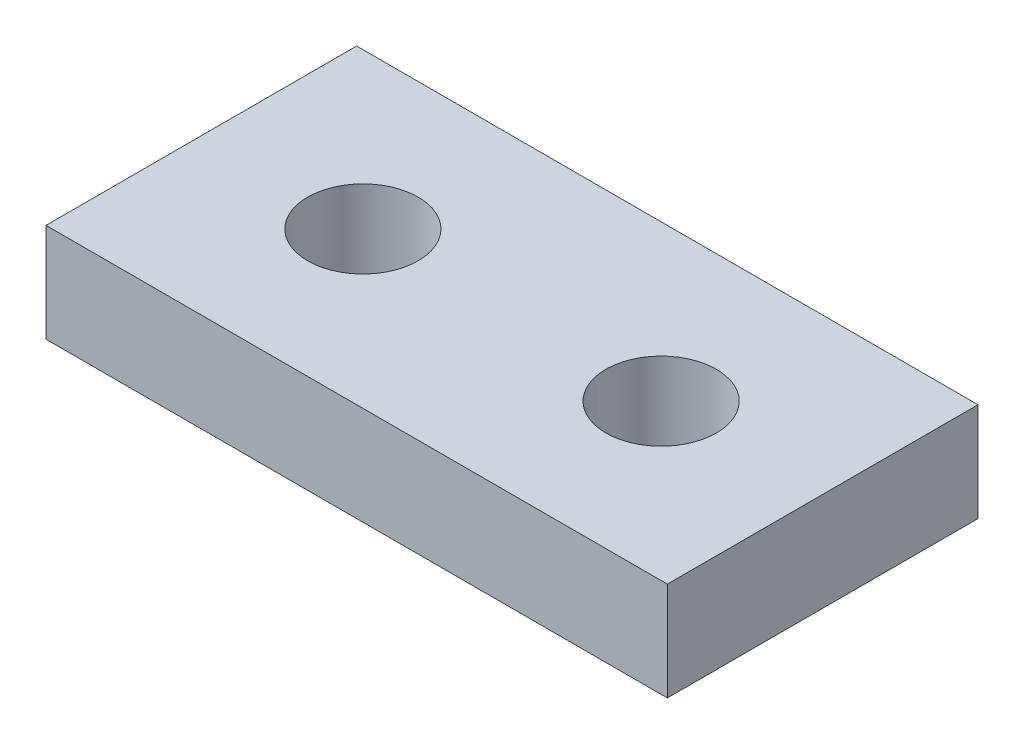
ISO-10303-21;
HEADER;
FILE_DESCRIPTION(('STEP AP214'),'2;1');
FILE_NAME('part.step','',(''),(''),'','','');
FILE_SCHEMA(('AUTOMOTIVE_DESIGN { 1 0 10303 214 1 1 1 1 }'));
ENDSEC;
DATA;
#1=APPLICATION_CONTEXT('core data for automotive mechanical design processes');
#2=APPLICATION_PROTOCOL_DEFINITION('international standard','automotive_design',2000,#1);
#3=PRODUCT_CONTEXT('',#1,'mechanical');
#4=PRODUCT('Part','Part','',(#3));
#5=PRODUCT_RELATED_PRODUCT_CATEGORY('part','',(#4));
#6=PRODUCT_DEFINITION_FORMATION('','',#4);
#7=PRODUCT_DEFINITION_CONTEXT('part definition',#1,'design');
#8=PRODUCT_DEFINITION('design','',#6,#7);
#9=PRODUCT_DEFINITION_SHAPE('','',#8);
#10=(LENGTH_UNIT() NAMED_UNIT(*) SI_UNIT(.MILLI.,.METRE.));
#11=(NAMED_UNIT(*) PLANE_ANGLE_UNIT() SI_UNIT($,.RADIAN.));
#12=(NAMED_UNIT(*) SI_UNIT($,.STERADIAN.) SOLID_ANGLE_UNIT());
#13=UNCERTAINTY_MEASURE_WITH_UNIT(LENGTH_MEASURE(1.E-05),#10,'distance_accuracy_value','');
#14=(GEOMETRIC_REPRESENTATION_CONTEXT(3) GLOBAL_UNCERTAINTY_ASSIGNED_CONTEXT((#13)) GLOBAL_UNIT_ASSIGNED_CONTEXT((#10,
#11,#12)) REPRESENTATION_CONTEXT('',''));
#15=CARTESIAN_POINT('',(0.,0.,0.));
#16=DIRECTION('',(0.,0.,1.));
#17=DIRECTION('',(1.,0.,0.));
#18=AXIS2_PLACEMENT_3D('',#15,#16,#17);
#19=CARTESIAN_POINT('',(5.,1.5875,-2.5));
#20=DIRECTION('',(-1.,0.,0.));
#21=DIRECTION('',(0.,0.,1.));
#22=AXIS2_PLACEMENT_3D('',#19,#20,#21);
#23=PLANE('',#22);
#24=DIRECTION('',(0.,0.,-1.));
#25=VECTOR('',#24,1.);
#26=CARTESIAN_POINT('',(5.,0.,-2.5));
#27=LINE('',#26,#25);
#28=CARTESIAN_POINT('',(5.,0.,2.5));
#29=VERTEX_POINT('',#28);
#30=CARTESIAN_POINT('',(5.,0.,-2.5));
#31=VERTEX_POINT('',#30);
#32=EDGE_CURVE('E105',#29,#31,#27,.T.);
#33=ORIENTED_EDGE('',*,*,#32,.T.);
#34=DIRECTION('',(0.,-1.,0.));
#35=VECTOR('',#34,1.);
#36=CARTESIAN_POINT('',(5.,1.5875,-2.5));
#37=LINE('',#36,#35);
#38=CARTESIAN_POINT('',(5.,1.5875,-2.5));
#39=VERTEX_POINT('',#38);
#40=EDGE_CURVE('E11',#39,#31,#37,.T.);
#41=ORIENTED_EDGE('',*,*,#40,.F.);
#42=DIRECTION('',(0.,0.,-1.));
#43=VECTOR('',#42,1.);
#44=CARTESIAN_POINT('',(5.,1.5875,-2.5));
#45=LINE('',#44,#43);
#46=CARTESIAN_POINT('',(5.,1.5875,2.5));
#47=VERTEX_POINT('',#46);
#48=EDGE_CURVE('E92',#47,#39,#45,.T.);
#49=ORIENTED_EDGE('',*,*,#48,.F.);
#50=DIRECTION('',(0.,-1.,0.));
#51=VECTOR('',#50,1.);
#52=CARTESIAN_POINT('',(5.,1.5875,2.5));
#53=LINE('',#52,#51);
#54=EDGE_CURVE('E101',#47,#29,#53,.T.);
#55=ORIENTED_EDGE('',*,*,#54,.T.);
#56=EDGE_LOOP('',(#33,#41,#49,#55));
#57=FACE_BOUND('',#56,.T.);
#58=ADVANCED_FACE('F40',(#57),#23,.F.);
#59=CARTESIAN_POINT('',(-5.,1.5875,-2.5));
#60=DIRECTION('',(0.,0.,1.));
#61=DIRECTION('',(1.,0.,0.));
#62=AXIS2_PLACEMENT_3D('',#59,#60,#61);
#63=PLANE('',#62);
#64=DIRECTION('',(-1.,0.,0.));
#65=VECTOR('',#64,1.);
#66=CARTESIAN_POINT('',(-5.,0.,-2.5));
#67=LINE('',#66,#65);
#68=CARTESIAN_POINT('',(-5.,0.,-2.5));
#69=VERTEX_POINT('',#68);
#70=EDGE_CURVE('E96',#31,#69,#67,.T.);
#71=ORIENTED_EDGE('',*,*,#70,.T.);
#72=DIRECTION('',(0.,-1.,0.));
#73=VECTOR('',#72,1.);
#74=CARTESIAN_POINT('',(-5.,1.5875,-2.5));
#75=LINE('',#74,#73);
#76=CARTESIAN_POINT('',(-5.,1.5875,-2.5));
#77=VERTEX_POINT('',#76);
#78=EDGE_CURVE('E49',#77,#69,#75,.T.);
#79=ORIENTED_EDGE('',*,*,#78,.F.);
#80=DIRECTION('',(-1.,0.,0.));
#81=VECTOR('',#80,1.);
#82=CARTESIAN_POINT('',(-5.,1.5875,-2.5));
#83=LINE('',#82,#81);
#84=EDGE_CURVE('E87',#39,#77,#83,.T.);
#85=ORIENTED_EDGE('',*,*,#84,.F.);
#86=ORIENTED_EDGE('',*,*,#40,.T.);
#87=EDGE_LOOP('',(#71,#79,#85,#86));
#88=FACE_BOUND('',#87,.T.);
#89=ADVANCED_FACE('F95',(#88),#63,.F.);
#90=CARTESIAN_POINT('',(-5.,1.5875,-2.5));
#91=DIRECTION('',(1.,0.,0.));
#92=DIRECTION('',(0.,0.,-1.));
#93=AXIS2_PLACEMENT_3D('',#90,#91,#92);
#94=PLANE('',#93);
#95=DIRECTION('',(0.,0.,1.));
#96=VECTOR('',#95,1.);
#97=CARTESIAN_POINT('',(-5.,0.,-2.5));
#98=LINE('',#97,#96);
#99=CARTESIAN_POINT('',(-5.,0.,2.5));
#100=VERTEX_POINT('',#99);
#101=EDGE_CURVE('E74',#69,#100,#98,.T.);
#102=ORIENTED_EDGE('',*,*,#101,.T.);
#103=DIRECTION('',(0.,-1.,0.));
#104=VECTOR('',#103,1.);
#105=CARTESIAN_POINT('',(-5.,1.5875,2.5));
#106=LINE('',#105,#104);
#107=CARTESIAN_POINT('',(-5.,1.5875,2.5));
#108=VERTEX_POINT('',#107);
#109=EDGE_CURVE('E97',#108,#100,#106,.T.);
#110=ORIENTED_EDGE('',*,*,#109,.F.);
#111=DIRECTION('',(0.,0.,1.));
#112=VECTOR('',#111,1.);
#113=CARTESIAN_POINT('',(-5.,1.5875,-2.5));
#114=LINE('',#113,#112);
#115=EDGE_CURVE('E90',#77,#108,#114,.T.);
#116=ORIENTED_EDGE('',*,*,#115,.F.);
#117=ORIENTED_EDGE('',*,*,#78,.T.);
#118=EDGE_LOOP('',(#102,#110,#116,#117));
#119=FACE_BOUND('',#118,.T.);
#120=ADVANCED_FACE('F99',(#119),#94,.F.);
#121=CARTESIAN_POINT('',(-5.,1.5875,2.5));
#122=DIRECTION('',(0.,0.,-1.));
#123=DIRECTION('',(-1.,0.,0.));
#124=AXIS2_PLACEMENT_3D('',#121,#122,#123);
#125=PLANE('',#124);
#126=DIRECTION('',(1.,0.,0.));
#127=VECTOR('',#126,1.);
#128=CARTESIAN_POINT('',(-5.,0.,2.5));
#129=LINE('',#128,#127);
#130=EDGE_CURVE('E80',#100,#29,#129,.T.);
#131=ORIENTED_EDGE('',*,*,#130,.T.);
#132=ORIENTED_EDGE('',*,*,#54,.F.);
#133=DIRECTION('',(1.,0.,0.));
#134=VECTOR('',#133,1.);
#135=CARTESIAN_POINT('',(-5.,1.5875,2.5));
#136=LINE('',#135,#134);
#137=EDGE_CURVE('E57',#108,#47,#136,.T.);
#138=ORIENTED_EDGE('',*,*,#137,.F.);
#139=ORIENTED_EDGE('',*,*,#109,.T.);
#140=EDGE_LOOP('',(#131,#132,#138,#139));
#141=FACE_BOUND('',#140,.T.);
#142=ADVANCED_FACE('F113',(#141),#125,.F.);
#143=CARTESIAN_POINT('',(0.,1.5875,0.));
#144=DIRECTION('',(0.,1.,0.));
#145=DIRECTION('',(0.,0.,1.));
#146=AXIS2_PLACEMENT_3D('',#143,#144,#145);
#147=PLANE('',#146);
#148=CARTESIAN_POINT('',(-2.4,1.5875,0.));
#149=DIRECTION('',(0.,1.,0.));
#150=DIRECTION('',(0.,0.,1.));
#151=AXIS2_PLACEMENT_3D('',#148,#149,#150);
#152=CIRCLE('',#151,0.888999999999999);
#153=CARTESIAN_POINT('',(-2.4,1.5875,0.888999999999999));
#154=VERTEX_POINT('',#153);
#155=EDGE_CURVE('E124',#154,#154,#152,.T.);
#156=ORIENTED_EDGE('',*,*,#155,.F.);
#157=EDGE_LOOP('',(#156));
#158=FACE_BOUND('',#157,.T.);
#159=CARTESIAN_POINT('',(2.4,1.5875,0.));
#160=DIRECTION('',(0.,1.,0.));
#161=DIRECTION('',(0.,0.,1.));
#162=AXIS2_PLACEMENT_3D('',#159,#160,#161);
#163=CIRCLE('',#162,0.888999999999999);
#164=CARTESIAN_POINT('',(2.4,1.5875,0.888999999999998));
#165=VERTEX_POINT('',#164);
#166=EDGE_CURVE('E121',#165,#165,#163,.T.);
#167=ORIENTED_EDGE('',*,*,#166,.F.);
#168=EDGE_LOOP('',(#167));
#169=FACE_BOUND('',#168,.T.);
#170=ORIENTED_EDGE('',*,*,#48,.T.);
#171=ORIENTED_EDGE('',*,*,#84,.T.);
#172=ORIENTED_EDGE('',*,*,#115,.T.);
#173=ORIENTED_EDGE('',*,*,#137,.T.);
#174=EDGE_LOOP('',(#170,#171,#172,#173));
#175=FACE_BOUND('',#174,.T.);
#176=ADVANCED_FACE('F88',(#158,#169,#175),#147,.T.);
#177=CARTESIAN_POINT('',(0.,0.,0.));
#178=DIRECTION('',(0.,1.,0.));
#179=DIRECTION('',(0.,0.,1.));
#180=AXIS2_PLACEMENT_3D('',#177,#178,#179);
#181=PLANE('',#180);
#182=CARTESIAN_POINT('',(-2.4,0.,0.));
#183=DIRECTION('',(0.,1.,0.));
#184=DIRECTION('',(0.,0.,1.));
#185=AXIS2_PLACEMENT_3D('',#182,#183,#184);
#186=CIRCLE('',#185,0.888999999999999);
#187=CARTESIAN_POINT('',(-2.4,0.,0.888999999999999));
#188=VERTEX_POINT('',#187);
#189=EDGE_CURVE('E43',#188,#188,#186,.T.);
#190=ORIENTED_EDGE('',*,*,#189,.T.);
#191=EDGE_LOOP('',(#190));
#192=FACE_BOUND('',#191,.T.);
#193=CARTESIAN_POINT('',(2.4,0.,0.));
#194=DIRECTION('',(0.,1.,0.));
#195=DIRECTION('',(0.,0.,1.));
#196=AXIS2_PLACEMENT_3D('',#193,#194,#195);
#197=CIRCLE('',#196,0.888999999999999);
#198=CARTESIAN_POINT('',(2.4,0.,0.888999999999998));
#199=VERTEX_POINT('',#198);
#200=EDGE_CURVE('E108',#199,#199,#197,.T.);
#201=ORIENTED_EDGE('',*,*,#200,.T.);
#202=EDGE_LOOP('',(#201));
#203=FACE_BOUND('',#202,.T.);
#204=ORIENTED_EDGE('',*,*,#32,.F.);
#205=ORIENTED_EDGE('',*,*,#130,.F.);
#206=ORIENTED_EDGE('',*,*,#101,.F.);
#207=ORIENTED_EDGE('',*,*,#70,.F.);
#208=EDGE_LOOP('',(#204,#205,#206,#207));
#209=FACE_BOUND('',#208,.T.);
#210=ADVANCED_FACE('F116',(#192,#203,#209),#181,.F.);
#211=CARTESIAN_POINT('',(2.4,1.5875,0.));
#212=DIRECTION('',(0.,1.,0.));
#213=DIRECTION('',(0.,0.,1.));
#214=AXIS2_PLACEMENT_3D('',#211,#212,#213);
#215=CYLINDRICAL_SURFACE('',#214,0.888999999999999);
#216=ORIENTED_EDGE('',*,*,#166,.T.);
#217=EDGE_LOOP('',(#216));
#218=FACE_BOUND('',#217,.T.);
#219=ORIENTED_EDGE('',*,*,#200,.F.);
#220=EDGE_LOOP('',(#219));
#221=FACE_BOUND('',#220,.T.);
#222=ADVANCED_FACE('F135',(#218,#221),#215,.F.);
#223=CARTESIAN_POINT('',(-2.4,1.5875,0.));
#224=DIRECTION('',(0.,1.,0.));
#225=DIRECTION('',(0.,0.,1.));
#226=AXIS2_PLACEMENT_3D('',#223,#224,#225);
#227=CYLINDRICAL_SURFACE('',#226,0.888999999999999);
#228=ORIENTED_EDGE('',*,*,#155,.T.);
#229=EDGE_LOOP('',(#228));
#230=FACE_BOUND('',#229,.T.);
#231=ORIENTED_EDGE('',*,*,#189,.F.);
#232=EDGE_LOOP('',(#231));
#233=FACE_BOUND('',#232,.T.);
#234=ADVANCED_FACE('F133',(#230,#233),#227,.F.);
#235=CLOSED_SHELL('',(#58,#89,#120,#142,#176,#210,#222,#234));
#236=MANIFOLD_SOLID_BREP('B2',#235);
#237=ADVANCED_BREP_SHAPE_REPRESENTATION('',(#18,#236),#14);
#238=SHAPE_DEFINITION_REPRESENTATION(#9,#237);
ENDSEC;
END-ISO-10303-21;
